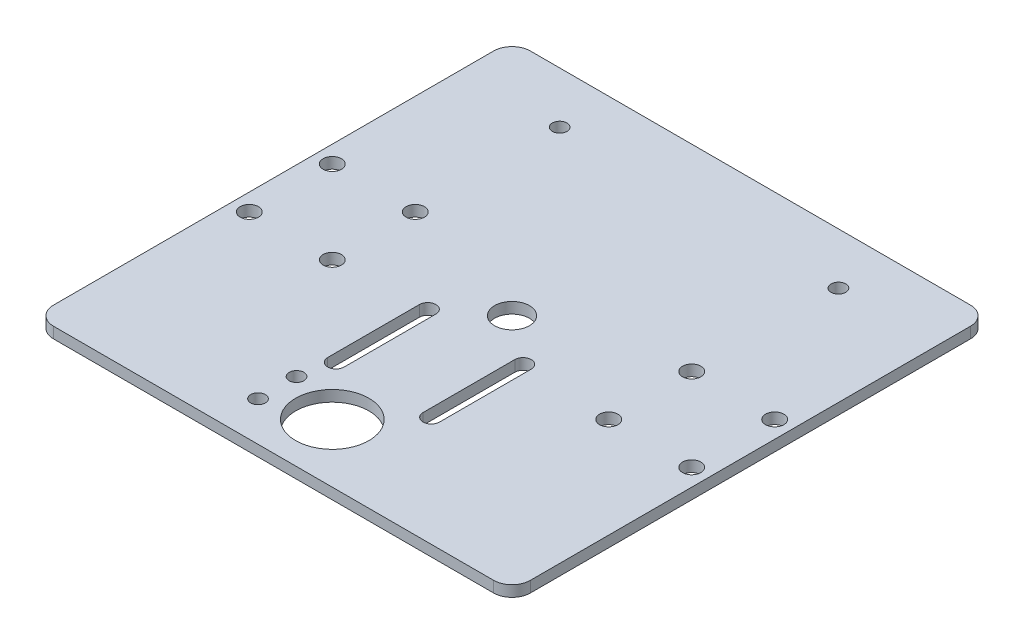
ISO-10303-21;
HEADER;
FILE_DESCRIPTION(('STEP AP214'),'2;1');
FILE_NAME('part.step','',(''),(''),'','','');
FILE_SCHEMA(('AUTOMOTIVE_DESIGN { 1 0 10303 214 1 1 1 1 }'));
ENDSEC;
DATA;
#1=APPLICATION_CONTEXT('core data for automotive mechanical design processes');
#2=APPLICATION_PROTOCOL_DEFINITION('international standard','automotive_design',2000,#1);
#3=PRODUCT_CONTEXT('',#1,'mechanical');
#4=PRODUCT('Part','Part','',(#3));
#5=PRODUCT_RELATED_PRODUCT_CATEGORY('part','',(#4));
#6=PRODUCT_DEFINITION_FORMATION('','',#4);
#7=PRODUCT_DEFINITION_CONTEXT('part definition',#1,'design');
#8=PRODUCT_DEFINITION('design','',#6,#7);
#9=PRODUCT_DEFINITION_SHAPE('','',#8);
#10=(LENGTH_UNIT() NAMED_UNIT(*) SI_UNIT(.MILLI.,.METRE.));
#11=(NAMED_UNIT(*) PLANE_ANGLE_UNIT() SI_UNIT($,.RADIAN.));
#12=(NAMED_UNIT(*) SI_UNIT($,.STERADIAN.) SOLID_ANGLE_UNIT());
#13=UNCERTAINTY_MEASURE_WITH_UNIT(LENGTH_MEASURE(1.E-05),#10,'distance_accuracy_value','');
#14=(GEOMETRIC_REPRESENTATION_CONTEXT(3) GLOBAL_UNCERTAINTY_ASSIGNED_CONTEXT((#13)) GLOBAL_UNIT_ASSIGNED_CONTEXT((#10,
#11,#12)) REPRESENTATION_CONTEXT('',''));
#15=CARTESIAN_POINT('',(0.,0.,0.));
#16=DIRECTION('',(0.,0.,1.));
#17=DIRECTION('',(1.,0.,0.));
#18=AXIS2_PLACEMENT_3D('',#15,#16,#17);
#19=CARTESIAN_POINT('',(0.,0.,0.));
#20=DIRECTION('',(0.,1.,0.));
#21=DIRECTION('',(0.,0.,1.));
#22=AXIS2_PLACEMENT_3D('',#19,#20,#21);
#23=PLANE('',#22);
#24=CARTESIAN_POINT('',(-15.,0.,54.25));
#25=DIRECTION('',(0.,1.,0.));
#26=DIRECTION('',(0.,0.,1.));
#27=AXIS2_PLACEMENT_3D('',#24,#25,#26);
#28=CIRCLE('',#27,2.);
#29=CARTESIAN_POINT('',(-15.,0.,56.25));
#30=VERTEX_POINT('',#29);
#31=EDGE_CURVE('E655',#30,#30,#28,.T.);
#32=ORIENTED_EDGE('',*,*,#31,.T.);
#33=EDGE_LOOP('',(#32));
#34=FACE_BOUND('',#33,.T.);
#35=CARTESIAN_POINT('',(-15.,0.,43.75));
#36=DIRECTION('',(0.,1.,0.));
#37=DIRECTION('',(0.,0.,1.));
#38=AXIS2_PLACEMENT_3D('',#35,#36,#37);
#39=CIRCLE('',#38,2.);
#40=CARTESIAN_POINT('',(-15.,0.,45.75));
#41=VERTEX_POINT('',#40);
#42=EDGE_CURVE('E175',#41,#41,#39,.T.);
#43=ORIENTED_EDGE('',*,*,#42,.T.);
#44=EDGE_LOOP('',(#43));
#45=FACE_BOUND('',#44,.T.);
#46=CARTESIAN_POINT('',(13.,0.,35.));
#47=DIRECTION('',(0.,1.,0.));
#48=DIRECTION('',(0.,0.,1.));
#49=AXIS2_PLACEMENT_3D('',#46,#47,#48);
#50=CIRCLE('',#49,2.25);
#51=CARTESIAN_POINT('',(10.75,0.,35.));
#52=VERTEX_POINT('',#51);
#53=CARTESIAN_POINT('',(15.25,0.,35.));
#54=VERTEX_POINT('',#53);
#55=EDGE_CURVE('E188',#52,#54,#50,.T.);
#56=ORIENTED_EDGE('',*,*,#55,.T.);
#57=DIRECTION('',(0.,0.,-1.));
#58=VECTOR('',#57,1.);
#59=CARTESIAN_POINT('',(15.25,0.,35.));
#60=LINE('',#59,#58);
#61=CARTESIAN_POINT('',(15.25,0.,10.));
#62=VERTEX_POINT('',#61);
#63=EDGE_CURVE('E204',#54,#62,#60,.T.);
#64=ORIENTED_EDGE('',*,*,#63,.T.);
#65=CARTESIAN_POINT('',(13.,0.,9.99999999999999));
#66=DIRECTION('',(0.,1.,0.));
#67=DIRECTION('',(0.,0.,1.));
#68=AXIS2_PLACEMENT_3D('',#65,#66,#67);
#69=CIRCLE('',#68,2.25);
#70=CARTESIAN_POINT('',(10.75,0.,9.99999999999999));
#71=VERTEX_POINT('',#70);
#72=EDGE_CURVE('E207',#62,#71,#69,.T.);
#73=ORIENTED_EDGE('',*,*,#72,.T.);
#74=DIRECTION('',(0.,0.,1.));
#75=VECTOR('',#74,1.);
#76=CARTESIAN_POINT('',(10.75,0.,35.));
#77=LINE('',#76,#75);
#78=EDGE_CURVE('E194',#71,#52,#77,.T.);
#79=ORIENTED_EDGE('',*,*,#78,.T.);
#80=EDGE_LOOP('',(#56,#64,#73,#79));
#81=FACE_BOUND('',#80,.T.);
#82=CARTESIAN_POINT('',(38.,0.,-51.));
#83=DIRECTION('',(0.,1.,0.));
#84=DIRECTION('',(0.,0.,1.));
#85=AXIS2_PLACEMENT_3D('',#82,#83,#84);
#86=CIRCLE('',#85,2.);
#87=CARTESIAN_POINT('',(38.,0.,-49.));
#88=VERTEX_POINT('',#87);
#89=EDGE_CURVE('E224',#88,#88,#86,.T.);
#90=ORIENTED_EDGE('',*,*,#89,.T.);
#91=EDGE_LOOP('',(#90));
#92=FACE_BOUND('',#91,.T.);
#93=CARTESIAN_POINT('',(-38.,0.,-51.));
#94=DIRECTION('',(0.,1.,0.));
#95=DIRECTION('',(0.,0.,1.));
#96=AXIS2_PLACEMENT_3D('',#93,#94,#95);
#97=CIRCLE('',#96,2.);
#98=CARTESIAN_POINT('',(-38.,0.,-49.));
#99=VERTEX_POINT('',#98);
#100=EDGE_CURVE('E230',#99,#99,#97,.T.);
#101=ORIENTED_EDGE('',*,*,#100,.T.);
#102=EDGE_LOOP('',(#101));
#103=FACE_BOUND('',#102,.T.);
#104=CARTESIAN_POINT('',(37.6862915010152,0.,11.3137084989847));
#105=DIRECTION('',(0.,-1.,0.));
#106=DIRECTION('',(0.,0.,-1.));
#107=AXIS2_PLACEMENT_3D('',#104,#105,#106);
#108=CIRCLE('',#107,2.5);
#109=CARTESIAN_POINT('',(37.6862915010152,0.,8.81370849898474));
#110=VERTEX_POINT('',#109);
#111=EDGE_CURVE('E245',#110,#110,#108,.T.);
#112=ORIENTED_EDGE('',*,*,#111,.F.);
#113=EDGE_LOOP('',(#112));
#114=FACE_BOUND('',#113,.T.);
#115=CARTESIAN_POINT('',(-60.3137084989848,0.,-11.3137084989848));
#116=DIRECTION('',(0.,-1.,0.));
#117=DIRECTION('',(0.,0.,-1.));
#118=AXIS2_PLACEMENT_3D('',#115,#116,#117);
#119=CIRCLE('',#118,2.5);
#120=CARTESIAN_POINT('',(-60.3137084989848,0.,-13.8137084989848));
#121=VERTEX_POINT('',#120);
#122=EDGE_CURVE('E257',#121,#121,#119,.T.);
#123=ORIENTED_EDGE('',*,*,#122,.F.);
#124=EDGE_LOOP('',(#123));
#125=FACE_BOUND('',#124,.T.);
#126=CARTESIAN_POINT('',(-60.3137084989848,0.,11.3137084989847));
#127=DIRECTION('',(0.,-1.,0.));
#128=DIRECTION('',(0.,0.,-1.));
#129=AXIS2_PLACEMENT_3D('',#126,#127,#128);
#130=CIRCLE('',#129,2.5);
#131=CARTESIAN_POINT('',(-60.3137084989848,0.,8.81370849898474));
#132=VERTEX_POINT('',#131);
#133=EDGE_CURVE('E263',#132,#132,#130,.T.);
#134=ORIENTED_EDGE('',*,*,#133,.F.);
#135=EDGE_LOOP('',(#134));
#136=FACE_BOUND('',#135,.T.);
#137=CARTESIAN_POINT('',(-37.6862915010152,0.,11.3137084989847));
#138=DIRECTION('',(0.,-1.,0.));
#139=DIRECTION('',(0.,0.,-1.));
#140=AXIS2_PLACEMENT_3D('',#137,#138,#139);
#141=CIRCLE('',#140,2.5);
#142=CARTESIAN_POINT('',(-37.6862915010152,0.,8.81370849898474));
#143=VERTEX_POINT('',#142);
#144=EDGE_CURVE('E269',#143,#143,#141,.T.);
#145=ORIENTED_EDGE('',*,*,#144,.F.);
#146=EDGE_LOOP('',(#145));
#147=FACE_BOUND('',#146,.T.);
#148=CARTESIAN_POINT('',(-37.6862915010152,0.,-11.3137084989848));
#149=DIRECTION('',(0.,-1.,0.));
#150=DIRECTION('',(0.,0.,-1.));
#151=AXIS2_PLACEMENT_3D('',#148,#149,#150);
#152=CIRCLE('',#151,2.5);
#153=CARTESIAN_POINT('',(-37.6862915010152,0.,-13.8137084989848));
#154=VERTEX_POINT('',#153);
#155=EDGE_CURVE('E275',#154,#154,#152,.T.);
#156=ORIENTED_EDGE('',*,*,#155,.F.);
#157=EDGE_LOOP('',(#156));
#158=FACE_BOUND('',#157,.T.);
#159=CARTESIAN_POINT('',(0.,0.,0.));
#160=DIRECTION('',(0.,1.,0.));
#161=DIRECTION('',(0.,0.,1.));
#162=AXIS2_PLACEMENT_3D('',#159,#160,#161);
#163=CIRCLE('',#162,4.75);
#164=CARTESIAN_POINT('',(0.,0.,4.74999999999999));
#165=VERTEX_POINT('',#164);
#166=EDGE_CURVE('E281',#165,#165,#163,.T.);
#167=ORIENTED_EDGE('',*,*,#166,.T.);
#168=EDGE_LOOP('',(#167));
#169=FACE_BOUND('',#168,.T.);
#170=DIRECTION('',(0.,0.,-1.));
#171=VECTOR('',#170,1.);
#172=CARTESIAN_POINT('',(65.,0.,-65.));
#173=LINE('',#172,#171);
#174=CARTESIAN_POINT('',(65.,0.,60.));
#175=VERTEX_POINT('',#174);
#176=CARTESIAN_POINT('',(65.,0.,-60.));
#177=VERTEX_POINT('',#176);
#178=EDGE_CURVE('E285',#175,#177,#173,.T.);
#179=ORIENTED_EDGE('',*,*,#178,.F.);
#180=CARTESIAN_POINT('',(60.,0.,60.));
#181=DIRECTION('',(0.,1.,0.));
#182=DIRECTION('',(0.,0.,1.));
#183=AXIS2_PLACEMENT_3D('',#180,#181,#182);
#184=CIRCLE('',#183,5.);
#185=CARTESIAN_POINT('',(60.,0.,65.));
#186=VERTEX_POINT('',#185);
#187=EDGE_CURVE('E322',#175,#186,#184,.F.);
#188=ORIENTED_EDGE('',*,*,#187,.T.);
#189=DIRECTION('',(1.,0.,0.));
#190=VECTOR('',#189,1.);
#191=CARTESIAN_POINT('',(-65.,0.,65.));
#192=LINE('',#191,#190);
#193=CARTESIAN_POINT('',(-60.,0.,65.));
#194=VERTEX_POINT('',#193);
#195=EDGE_CURVE('E292',#194,#186,#192,.T.);
#196=ORIENTED_EDGE('',*,*,#195,.F.);
#197=CARTESIAN_POINT('',(-60.,0.,60.));
#198=DIRECTION('',(0.,1.,0.));
#199=DIRECTION('',(0.,0.,1.));
#200=AXIS2_PLACEMENT_3D('',#197,#198,#199);
#201=CIRCLE('',#200,5.);
#202=CARTESIAN_POINT('',(-65.,0.,60.));
#203=VERTEX_POINT('',#202);
#204=EDGE_CURVE('E316',#194,#203,#201,.F.);
#205=ORIENTED_EDGE('',*,*,#204,.T.);
#206=DIRECTION('',(0.,0.,1.));
#207=VECTOR('',#206,1.);
#208=CARTESIAN_POINT('',(-65.,0.,-65.));
#209=LINE('',#208,#207);
#210=CARTESIAN_POINT('',(-65.,0.,-60.));
#211=VERTEX_POINT('',#210);
#212=EDGE_CURVE('E307',#211,#203,#209,.T.);
#213=ORIENTED_EDGE('',*,*,#212,.F.);
#214=CARTESIAN_POINT('',(-60.,0.,-60.));
#215=DIRECTION('',(0.,1.,0.));
#216=DIRECTION('',(0.,0.,1.));
#217=AXIS2_PLACEMENT_3D('',#214,#215,#216);
#218=CIRCLE('',#217,5.);
#219=CARTESIAN_POINT('',(-60.,0.,-65.));
#220=VERTEX_POINT('',#219);
#221=EDGE_CURVE('E318',#211,#220,#218,.F.);
#222=ORIENTED_EDGE('',*,*,#221,.T.);
#223=DIRECTION('',(-1.,0.,0.));
#224=VECTOR('',#223,1.);
#225=CARTESIAN_POINT('',(-65.,0.,-65.));
#226=LINE('',#225,#224);
#227=CARTESIAN_POINT('',(60.,0.,-65.));
#228=VERTEX_POINT('',#227);
#229=EDGE_CURVE('E304',#228,#220,#226,.T.);
#230=ORIENTED_EDGE('',*,*,#229,.F.);
#231=CARTESIAN_POINT('',(60.,0.,-60.));
#232=DIRECTION('',(0.,1.,0.));
#233=DIRECTION('',(0.,0.,1.));
#234=AXIS2_PLACEMENT_3D('',#231,#232,#233);
#235=CIRCLE('',#234,5.);
#236=EDGE_CURVE('E320',#228,#177,#235,.F.);
#237=ORIENTED_EDGE('',*,*,#236,.T.);
#238=EDGE_LOOP('',(#179,#188,#196,#205,#213,#222,#230,#237));
#239=FACE_BOUND('',#238,.T.);
#240=CARTESIAN_POINT('',(37.6862915010152,0.,-11.3137084989848));
#241=DIRECTION('',(0.,-1.,0.));
#242=DIRECTION('',(0.,0.,-1.));
#243=AXIS2_PLACEMENT_3D('',#240,#241,#242);
#244=CIRCLE('',#243,2.5);
#245=CARTESIAN_POINT('',(37.6862915010152,0.,-13.8137084989848));
#246=VERTEX_POINT('',#245);
#247=EDGE_CURVE('E251',#246,#246,#244,.T.);
#248=ORIENTED_EDGE('',*,*,#247,.F.);
#249=EDGE_LOOP('',(#248));
#250=FACE_BOUND('',#249,.T.);
#251=CARTESIAN_POINT('',(60.3137084989848,0.,11.3137084989847));
#252=DIRECTION('',(0.,-1.,0.));
#253=DIRECTION('',(0.,0.,-1.));
#254=AXIS2_PLACEMENT_3D('',#251,#252,#253);
#255=CIRCLE('',#254,2.5);
#256=CARTESIAN_POINT('',(60.3137084989848,0.,8.81370849898474));
#257=VERTEX_POINT('',#256);
#258=EDGE_CURVE('E239',#257,#257,#255,.T.);
#259=ORIENTED_EDGE('',*,*,#258,.F.);
#260=EDGE_LOOP('',(#259));
#261=FACE_BOUND('',#260,.T.);
#262=CARTESIAN_POINT('',(60.3137084989848,0.,-11.3137084989848));
#263=DIRECTION('',(0.,-1.,0.));
#264=DIRECTION('',(0.,0.,-1.));
#265=AXIS2_PLACEMENT_3D('',#262,#263,#264);
#266=CIRCLE('',#265,2.5);
#267=CARTESIAN_POINT('',(60.3137084989848,0.,-13.8137084989848));
#268=VERTEX_POINT('',#267);
#269=EDGE_CURVE('E233',#268,#268,#266,.T.);
#270=ORIENTED_EDGE('',*,*,#269,.F.);
#271=EDGE_LOOP('',(#270));
#272=FACE_BOUND('',#271,.T.);
#273=CARTESIAN_POINT('',(0.,0.,49.));
#274=DIRECTION('',(0.,1.,0.));
#275=DIRECTION('',(0.,0.,1.));
#276=AXIS2_PLACEMENT_3D('',#273,#274,#275);
#277=CIRCLE('',#276,10.);
#278=CARTESIAN_POINT('',(0.,0.,59.));
#279=VERTEX_POINT('',#278);
#280=EDGE_CURVE('E162',#279,#279,#277,.T.);
#281=ORIENTED_EDGE('',*,*,#280,.T.);
#282=EDGE_LOOP('',(#281));
#283=FACE_BOUND('',#282,.T.);
#284=CARTESIAN_POINT('',(-13.,0.,35.));
#285=DIRECTION('',(0.,1.,0.));
#286=DIRECTION('',(0.,0.,-1.));
#287=AXIS2_PLACEMENT_3D('',#284,#285,#286);
#288=CIRCLE('',#287,2.25);
#289=CARTESIAN_POINT('',(-15.25,0.,35.));
#290=VERTEX_POINT('',#289);
#291=CARTESIAN_POINT('',(-10.75,0.,35.));
#292=VERTEX_POINT('',#291);
#293=EDGE_CURVE('E48',#290,#292,#288,.T.);
#294=ORIENTED_EDGE('',*,*,#293,.T.);
#295=DIRECTION('',(0.,0.,-1.));
#296=VECTOR('',#295,1.);
#297=CARTESIAN_POINT('',(-10.75,0.,35.));
#298=LINE('',#297,#296);
#299=CARTESIAN_POINT('',(-10.75,0.,10.));
#300=VERTEX_POINT('',#299);
#301=EDGE_CURVE('E161',#292,#300,#298,.T.);
#302=ORIENTED_EDGE('',*,*,#301,.T.);
#303=CARTESIAN_POINT('',(-13.,0.,10.));
#304=DIRECTION('',(0.,1.,0.));
#305=DIRECTION('',(0.,0.,-1.));
#306=AXIS2_PLACEMENT_3D('',#303,#304,#305);
#307=CIRCLE('',#306,2.25);
#308=CARTESIAN_POINT('',(-15.25,0.,10.));
#309=VERTEX_POINT('',#308);
#310=EDGE_CURVE('E177',#300,#309,#307,.T.);
#311=ORIENTED_EDGE('',*,*,#310,.T.);
#312=DIRECTION('',(0.,0.,1.));
#313=VECTOR('',#312,1.);
#314=CARTESIAN_POINT('',(-15.25,0.,35.));
#315=LINE('',#314,#313);
#316=EDGE_CURVE('E155',#309,#290,#315,.T.);
#317=ORIENTED_EDGE('',*,*,#316,.T.);
#318=EDGE_LOOP('',(#294,#302,#311,#317));
#319=FACE_BOUND('',#318,.T.);
#320=ADVANCED_FACE('F33',(#34,#45,#81,#92,#103,#114,#125,#136,#147,#158,#169,#239,#250,#261,
#272,#283,#319),#23,.F.);
#321=CARTESIAN_POINT('',(0.,3.,0.));
#322=DIRECTION('',(0.,1.,0.));
#323=DIRECTION('',(0.,0.,1.));
#324=AXIS2_PLACEMENT_3D('',#321,#322,#323);
#325=PLANE('',#324);
#326=CARTESIAN_POINT('',(-15.,3.,54.25));
#327=DIRECTION('',(0.,1.,0.));
#328=DIRECTION('',(0.,0.,1.));
#329=AXIS2_PLACEMENT_3D('',#326,#327,#328);
#330=CIRCLE('',#329,2.);
#331=CARTESIAN_POINT('',(-15.,3.,56.25));
#332=VERTEX_POINT('',#331);
#333=EDGE_CURVE('E658',#332,#332,#330,.T.);
#334=ORIENTED_EDGE('',*,*,#333,.F.);
#335=EDGE_LOOP('',(#334));
#336=FACE_BOUND('',#335,.T.);
#337=CARTESIAN_POINT('',(-15.,3.,43.75));
#338=DIRECTION('',(0.,1.,0.));
#339=DIRECTION('',(0.,0.,1.));
#340=AXIS2_PLACEMENT_3D('',#337,#338,#339);
#341=CIRCLE('',#340,2.);
#342=CARTESIAN_POINT('',(-15.,3.,45.75));
#343=VERTEX_POINT('',#342);
#344=EDGE_CURVE('E660',#343,#343,#341,.T.);
#345=ORIENTED_EDGE('',*,*,#344,.F.);
#346=EDGE_LOOP('',(#345));
#347=FACE_BOUND('',#346,.T.);
#348=CARTESIAN_POINT('',(0.,3.,49.));
#349=DIRECTION('',(0.,1.,0.));
#350=DIRECTION('',(0.,0.,1.));
#351=AXIS2_PLACEMENT_3D('',#348,#349,#350);
#352=CIRCLE('',#351,10.);
#353=CARTESIAN_POINT('',(0.,3.,59.));
#354=VERTEX_POINT('',#353);
#355=EDGE_CURVE('E185',#354,#354,#352,.T.);
#356=ORIENTED_EDGE('',*,*,#355,.F.);
#357=EDGE_LOOP('',(#356));
#358=FACE_BOUND('',#357,.T.);
#359=CARTESIAN_POINT('',(38.,3.,-51.));
#360=DIRECTION('',(0.,1.,0.));
#361=DIRECTION('',(0.,0.,1.));
#362=AXIS2_PLACEMENT_3D('',#359,#360,#361);
#363=CIRCLE('',#362,2.);
#364=CARTESIAN_POINT('',(38.,3.,-49.));
#365=VERTEX_POINT('',#364);
#366=EDGE_CURVE('E221',#365,#365,#363,.T.);
#367=ORIENTED_EDGE('',*,*,#366,.F.);
#368=EDGE_LOOP('',(#367));
#369=FACE_BOUND('',#368,.T.);
#370=CARTESIAN_POINT('',(-38.,3.,-51.));
#371=DIRECTION('',(0.,1.,0.));
#372=DIRECTION('',(0.,0.,1.));
#373=AXIS2_PLACEMENT_3D('',#370,#371,#372);
#374=CIRCLE('',#373,2.);
#375=CARTESIAN_POINT('',(-38.,3.,-49.));
#376=VERTEX_POINT('',#375);
#377=EDGE_CURVE('E227',#376,#376,#374,.T.);
#378=ORIENTED_EDGE('',*,*,#377,.F.);
#379=EDGE_LOOP('',(#378));
#380=FACE_BOUND('',#379,.T.);
#381=CARTESIAN_POINT('',(60.3137084989848,3.,11.3137084989847));
#382=DIRECTION('',(0.,-1.,0.));
#383=DIRECTION('',(0.,0.,-1.));
#384=AXIS2_PLACEMENT_3D('',#381,#382,#383);
#385=CIRCLE('',#384,2.5);
#386=CARTESIAN_POINT('',(60.3137084989848,3.,8.81370849898474));
#387=VERTEX_POINT('',#386);
#388=EDGE_CURVE('E242',#387,#387,#385,.T.);
#389=ORIENTED_EDGE('',*,*,#388,.T.);
#390=EDGE_LOOP('',(#389));
#391=FACE_BOUND('',#390,.T.);
#392=DIRECTION('',(1.,0.,0.));
#393=VECTOR('',#392,1.);
#394=CARTESIAN_POINT('',(-65.,3.,65.));
#395=LINE('',#394,#393);
#396=CARTESIAN_POINT('',(-60.,3.,65.));
#397=VERTEX_POINT('',#396);
#398=CARTESIAN_POINT('',(60.,3.,65.));
#399=VERTEX_POINT('',#398);
#400=EDGE_CURVE('E298',#397,#399,#395,.T.);
#401=ORIENTED_EDGE('',*,*,#400,.T.);
#402=CARTESIAN_POINT('',(60.,3.,60.));
#403=DIRECTION('',(0.,1.,0.));
#404=DIRECTION('',(0.,0.,1.));
#405=AXIS2_PLACEMENT_3D('',#402,#403,#404);
#406=CIRCLE('',#405,5.);
#407=CARTESIAN_POINT('',(65.,3.,60.));
#408=VERTEX_POINT('',#407);
#409=EDGE_CURVE('E335',#399,#408,#406,.T.);
#410=ORIENTED_EDGE('',*,*,#409,.T.);
#411=DIRECTION('',(0.,0.,-1.));
#412=VECTOR('',#411,1.);
#413=CARTESIAN_POINT('',(65.,3.,-65.));
#414=LINE('',#413,#412);
#415=CARTESIAN_POINT('',(65.,3.,-60.));
#416=VERTEX_POINT('',#415);
#417=EDGE_CURVE('E288',#408,#416,#414,.T.);
#418=ORIENTED_EDGE('',*,*,#417,.T.);
#419=CARTESIAN_POINT('',(60.,3.,-60.));
#420=DIRECTION('',(0.,1.,0.));
#421=DIRECTION('',(0.,0.,1.));
#422=AXIS2_PLACEMENT_3D('',#419,#420,#421);
#423=CIRCLE('',#422,5.);
#424=CARTESIAN_POINT('',(60.,3.,-65.));
#425=VERTEX_POINT('',#424);
#426=EDGE_CURVE('E333',#416,#425,#423,.T.);
#427=ORIENTED_EDGE('',*,*,#426,.T.);
#428=DIRECTION('',(-1.,0.,0.));
#429=VECTOR('',#428,1.);
#430=CARTESIAN_POINT('',(-65.,3.,-65.));
#431=LINE('',#430,#429);
#432=CARTESIAN_POINT('',(-60.,3.,-65.));
#433=VERTEX_POINT('',#432);
#434=EDGE_CURVE('E291',#425,#433,#431,.T.);
#435=ORIENTED_EDGE('',*,*,#434,.T.);
#436=CARTESIAN_POINT('',(-60.,3.,-60.));
#437=DIRECTION('',(0.,1.,0.));
#438=DIRECTION('',(0.,0.,1.));
#439=AXIS2_PLACEMENT_3D('',#436,#437,#438);
#440=CIRCLE('',#439,5.);
#441=CARTESIAN_POINT('',(-65.,3.,-60.));
#442=VERTEX_POINT('',#441);
#443=EDGE_CURVE('E331',#433,#442,#440,.T.);
#444=ORIENTED_EDGE('',*,*,#443,.T.);
#445=DIRECTION('',(0.,0.,1.));
#446=VECTOR('',#445,1.);
#447=CARTESIAN_POINT('',(-65.,3.,-65.));
#448=LINE('',#447,#446);
#449=CARTESIAN_POINT('',(-65.,3.,60.));
#450=VERTEX_POINT('',#449);
#451=EDGE_CURVE('E295',#442,#450,#448,.T.);
#452=ORIENTED_EDGE('',*,*,#451,.T.);
#453=CARTESIAN_POINT('',(-60.,3.,60.));
#454=DIRECTION('',(0.,1.,0.));
#455=DIRECTION('',(0.,0.,1.));
#456=AXIS2_PLACEMENT_3D('',#453,#454,#455);
#457=CIRCLE('',#456,5.);
#458=EDGE_CURVE('E329',#450,#397,#457,.T.);
#459=ORIENTED_EDGE('',*,*,#458,.T.);
#460=EDGE_LOOP('',(#401,#410,#418,#427,#435,#444,#452,#459));
#461=FACE_BOUND('',#460,.T.);
#462=CARTESIAN_POINT('',(0.,3.,0.));
#463=DIRECTION('',(0.,1.,0.));
#464=DIRECTION('',(0.,0.,1.));
#465=AXIS2_PLACEMENT_3D('',#462,#463,#464);
#466=CIRCLE('',#465,4.75);
#467=CARTESIAN_POINT('',(0.,3.,4.74999999999999));
#468=VERTEX_POINT('',#467);
#469=EDGE_CURVE('E282',#468,#468,#466,.T.);
#470=ORIENTED_EDGE('',*,*,#469,.F.);
#471=EDGE_LOOP('',(#470));
#472=FACE_BOUND('',#471,.T.);
#473=CARTESIAN_POINT('',(-37.6862915010152,3.,-11.3137084989848));
#474=DIRECTION('',(0.,-1.,0.));
#475=DIRECTION('',(0.,0.,-1.));
#476=AXIS2_PLACEMENT_3D('',#473,#474,#475);
#477=CIRCLE('',#476,2.5);
#478=CARTESIAN_POINT('',(-37.6862915010152,3.,-13.8137084989848));
#479=VERTEX_POINT('',#478);
#480=EDGE_CURVE('E278',#479,#479,#477,.T.);
#481=ORIENTED_EDGE('',*,*,#480,.T.);
#482=EDGE_LOOP('',(#481));
#483=FACE_BOUND('',#482,.T.);
#484=CARTESIAN_POINT('',(-37.6862915010152,3.,11.3137084989847));
#485=DIRECTION('',(0.,-1.,0.));
#486=DIRECTION('',(0.,0.,-1.));
#487=AXIS2_PLACEMENT_3D('',#484,#485,#486);
#488=CIRCLE('',#487,2.5);
#489=CARTESIAN_POINT('',(-37.6862915010152,3.,8.81370849898474));
#490=VERTEX_POINT('',#489);
#491=EDGE_CURVE('E272',#490,#490,#488,.T.);
#492=ORIENTED_EDGE('',*,*,#491,.T.);
#493=EDGE_LOOP('',(#492));
#494=FACE_BOUND('',#493,.T.);
#495=CARTESIAN_POINT('',(-60.3137084989848,3.,11.3137084989847));
#496=DIRECTION('',(0.,-1.,0.));
#497=DIRECTION('',(0.,0.,-1.));
#498=AXIS2_PLACEMENT_3D('',#495,#496,#497);
#499=CIRCLE('',#498,2.5);
#500=CARTESIAN_POINT('',(-60.3137084989848,3.,8.81370849898474));
#501=VERTEX_POINT('',#500);
#502=EDGE_CURVE('E266',#501,#501,#499,.T.);
#503=ORIENTED_EDGE('',*,*,#502,.T.);
#504=EDGE_LOOP('',(#503));
#505=FACE_BOUND('',#504,.T.);
#506=CARTESIAN_POINT('',(-60.3137084989848,3.,-11.3137084989848));
#507=DIRECTION('',(0.,-1.,0.));
#508=DIRECTION('',(0.,0.,-1.));
#509=AXIS2_PLACEMENT_3D('',#506,#507,#508);
#510=CIRCLE('',#509,2.5);
#511=CARTESIAN_POINT('',(-60.3137084989848,3.,-13.8137084989848));
#512=VERTEX_POINT('',#511);
#513=EDGE_CURVE('E260',#512,#512,#510,.T.);
#514=ORIENTED_EDGE('',*,*,#513,.T.);
#515=EDGE_LOOP('',(#514));
#516=FACE_BOUND('',#515,.T.);
#517=CARTESIAN_POINT('',(37.6862915010152,3.,-11.3137084989848));
#518=DIRECTION('',(0.,-1.,0.));
#519=DIRECTION('',(0.,0.,-1.));
#520=AXIS2_PLACEMENT_3D('',#517,#518,#519);
#521=CIRCLE('',#520,2.5);
#522=CARTESIAN_POINT('',(37.6862915010152,3.,-13.8137084989848));
#523=VERTEX_POINT('',#522);
#524=EDGE_CURVE('E254',#523,#523,#521,.T.);
#525=ORIENTED_EDGE('',*,*,#524,.T.);
#526=EDGE_LOOP('',(#525));
#527=FACE_BOUND('',#526,.T.);
#528=CARTESIAN_POINT('',(37.6862915010152,3.,11.3137084989847));
#529=DIRECTION('',(0.,-1.,0.));
#530=DIRECTION('',(0.,0.,-1.));
#531=AXIS2_PLACEMENT_3D('',#528,#529,#530);
#532=CIRCLE('',#531,2.5);
#533=CARTESIAN_POINT('',(37.6862915010152,3.,8.81370849898474));
#534=VERTEX_POINT('',#533);
#535=EDGE_CURVE('E248',#534,#534,#532,.T.);
#536=ORIENTED_EDGE('',*,*,#535,.T.);
#537=EDGE_LOOP('',(#536));
#538=FACE_BOUND('',#537,.T.);
#539=CARTESIAN_POINT('',(60.3137084989848,3.,-11.3137084989848));
#540=DIRECTION('',(0.,-1.,0.));
#541=DIRECTION('',(0.,0.,-1.));
#542=AXIS2_PLACEMENT_3D('',#539,#540,#541);
#543=CIRCLE('',#542,2.5);
#544=CARTESIAN_POINT('',(60.3137084989848,3.,-13.8137084989848));
#545=VERTEX_POINT('',#544);
#546=EDGE_CURVE('E236',#545,#545,#543,.T.);
#547=ORIENTED_EDGE('',*,*,#546,.T.);
#548=EDGE_LOOP('',(#547));
#549=FACE_BOUND('',#548,.T.);
#550=DIRECTION('',(0.,0.,-1.));
#551=VECTOR('',#550,1.);
#552=CARTESIAN_POINT('',(15.25,3.,35.));
#553=LINE('',#552,#551);
#554=CARTESIAN_POINT('',(15.25,3.,35.));
#555=VERTEX_POINT('',#554);
#556=CARTESIAN_POINT('',(15.25,3.,10.));
#557=VERTEX_POINT('',#556);
#558=EDGE_CURVE('E193',#555,#557,#553,.T.);
#559=ORIENTED_EDGE('',*,*,#558,.F.);
#560=CARTESIAN_POINT('',(13.,3.,35.));
#561=DIRECTION('',(0.,1.,0.));
#562=DIRECTION('',(0.,0.,1.));
#563=AXIS2_PLACEMENT_3D('',#560,#561,#562);
#564=CIRCLE('',#563,2.25);
#565=CARTESIAN_POINT('',(10.75,3.,35.));
#566=VERTEX_POINT('',#565);
#567=EDGE_CURVE('E191',#566,#555,#564,.T.);
#568=ORIENTED_EDGE('',*,*,#567,.F.);
#569=DIRECTION('',(0.,0.,1.));
#570=VECTOR('',#569,1.);
#571=CARTESIAN_POINT('',(10.75,3.,35.));
#572=LINE('',#571,#570);
#573=CARTESIAN_POINT('',(10.75,3.,9.99999999999999));
#574=VERTEX_POINT('',#573);
#575=EDGE_CURVE('E199',#574,#566,#572,.T.);
#576=ORIENTED_EDGE('',*,*,#575,.F.);
#577=CARTESIAN_POINT('',(13.,3.,9.99999999999999));
#578=DIRECTION('',(0.,1.,0.));
#579=DIRECTION('',(0.,0.,1.));
#580=AXIS2_PLACEMENT_3D('',#577,#578,#579);
#581=CIRCLE('',#580,2.25);
#582=EDGE_CURVE('E196',#557,#574,#581,.T.);
#583=ORIENTED_EDGE('',*,*,#582,.F.);
#584=EDGE_LOOP('',(#559,#568,#576,#583));
#585=FACE_BOUND('',#584,.T.);
#586=DIRECTION('',(0.,0.,-1.));
#587=VECTOR('',#586,1.);
#588=CARTESIAN_POINT('',(-10.75,3.,35.));
#589=LINE('',#588,#587);
#590=CARTESIAN_POINT('',(-10.75,3.,35.));
#591=VERTEX_POINT('',#590);
#592=CARTESIAN_POINT('',(-10.75,3.,10.));
#593=VERTEX_POINT('',#592);
#594=EDGE_CURVE('E154',#591,#593,#589,.T.);
#595=ORIENTED_EDGE('',*,*,#594,.F.);
#596=CARTESIAN_POINT('',(-13.,3.,35.));
#597=DIRECTION('',(0.,1.,0.));
#598=DIRECTION('',(0.,0.,-1.));
#599=AXIS2_PLACEMENT_3D('',#596,#597,#598);
#600=CIRCLE('',#599,2.25);
#601=CARTESIAN_POINT('',(-15.25,3.,35.));
#602=VERTEX_POINT('',#601);
#603=EDGE_CURVE('E146',#602,#591,#600,.T.);
#604=ORIENTED_EDGE('',*,*,#603,.F.);
#605=DIRECTION('',(0.,0.,1.));
#606=VECTOR('',#605,1.);
#607=CARTESIAN_POINT('',(-15.25,3.,35.));
#608=LINE('',#607,#606);
#609=CARTESIAN_POINT('',(-15.25,3.,10.));
#610=VERTEX_POINT('',#609);
#611=EDGE_CURVE('E169',#610,#602,#608,.T.);
#612=ORIENTED_EDGE('',*,*,#611,.F.);
#613=CARTESIAN_POINT('',(-13.,3.,10.));
#614=DIRECTION('',(0.,1.,0.));
#615=DIRECTION('',(0.,0.,-1.));
#616=AXIS2_PLACEMENT_3D('',#613,#614,#615);
#617=CIRCLE('',#616,2.25);
#618=EDGE_CURVE('E167',#593,#610,#617,.T.);
#619=ORIENTED_EDGE('',*,*,#618,.F.);
#620=EDGE_LOOP('',(#595,#604,#612,#619));
#621=FACE_BOUND('',#620,.T.);
#622=ADVANCED_FACE('F166',(#336,#347,#358,#369,#380,#391,#461,#472,#483,#494,#505,#516,#527,
#538,#549,#585,#621),#325,.T.);
#623=CARTESIAN_POINT('',(65.,3.,-65.));
#624=DIRECTION('',(-1.,0.,0.));
#625=DIRECTION('',(0.,0.,1.));
#626=AXIS2_PLACEMENT_3D('',#623,#624,#625);
#627=PLANE('',#626);
#628=ORIENTED_EDGE('',*,*,#417,.F.);
#629=DIRECTION('',(0.,-1.,0.));
#630=VECTOR('',#629,1.);
#631=CARTESIAN_POINT('',(65.,3.,60.));
#632=LINE('',#631,#630);
#633=EDGE_CURVE('E313',#408,#175,#632,.T.);
#634=ORIENTED_EDGE('',*,*,#633,.T.);
#635=ORIENTED_EDGE('',*,*,#178,.T.);
#636=DIRECTION('',(0.,-1.,0.));
#637=VECTOR('',#636,1.);
#638=CARTESIAN_POINT('',(65.,3.,-60.));
#639=LINE('',#638,#637);
#640=EDGE_CURVE('E301',#177,#416,#639,.F.);
#641=ORIENTED_EDGE('',*,*,#640,.T.);
#642=EDGE_LOOP('',(#628,#634,#635,#641));
#643=FACE_BOUND('',#642,.T.);
#644=ADVANCED_FACE('F367',(#643),#627,.F.);
#645=CARTESIAN_POINT('',(-65.,3.,-65.));
#646=DIRECTION('',(0.,0.,1.));
#647=DIRECTION('',(1.,0.,0.));
#648=AXIS2_PLACEMENT_3D('',#645,#646,#647);
#649=PLANE('',#648);
#650=ORIENTED_EDGE('',*,*,#434,.F.);
#651=DIRECTION('',(0.,-1.,0.));
#652=VECTOR('',#651,1.);
#653=CARTESIAN_POINT('',(60.,3.,-65.));
#654=LINE('',#653,#652);
#655=EDGE_CURVE('E339',#425,#228,#654,.T.);
#656=ORIENTED_EDGE('',*,*,#655,.T.);
#657=ORIENTED_EDGE('',*,*,#229,.T.);
#658=DIRECTION('',(0.,-1.,0.));
#659=VECTOR('',#658,1.);
#660=CARTESIAN_POINT('',(-60.,3.,-65.));
#661=LINE('',#660,#659);
#662=EDGE_CURVE('E337',#220,#433,#661,.F.);
#663=ORIENTED_EDGE('',*,*,#662,.T.);
#664=EDGE_LOOP('',(#650,#656,#657,#663));
#665=FACE_BOUND('',#664,.T.);
#666=ADVANCED_FACE('F376',(#665),#649,.F.);
#667=CARTESIAN_POINT('',(-65.,3.,-65.));
#668=DIRECTION('',(1.,0.,0.));
#669=DIRECTION('',(0.,0.,-1.));
#670=AXIS2_PLACEMENT_3D('',#667,#668,#669);
#671=PLANE('',#670);
#672=ORIENTED_EDGE('',*,*,#451,.F.);
#673=DIRECTION('',(0.,-1.,0.));
#674=VECTOR('',#673,1.);
#675=CARTESIAN_POINT('',(-65.,3.,-60.));
#676=LINE('',#675,#674);
#677=EDGE_CURVE('E11',#442,#211,#676,.T.);
#678=ORIENTED_EDGE('',*,*,#677,.T.);
#679=ORIENTED_EDGE('',*,*,#212,.T.);
#680=DIRECTION('',(0.,-1.,0.));
#681=VECTOR('',#680,1.);
#682=CARTESIAN_POINT('',(-65.,3.,60.));
#683=LINE('',#682,#681);
#684=EDGE_CURVE('E41',#203,#450,#683,.F.);
#685=ORIENTED_EDGE('',*,*,#684,.T.);
#686=EDGE_LOOP('',(#672,#678,#679,#685));
#687=FACE_BOUND('',#686,.T.);
#688=ADVANCED_FACE('F344',(#687),#671,.F.);
#689=CARTESIAN_POINT('',(-65.,3.,65.));
#690=DIRECTION('',(0.,0.,-1.));
#691=DIRECTION('',(-1.,0.,0.));
#692=AXIS2_PLACEMENT_3D('',#689,#690,#691);
#693=PLANE('',#692);
#694=ORIENTED_EDGE('',*,*,#195,.T.);
#695=DIRECTION('',(0.,-1.,0.));
#696=VECTOR('',#695,1.);
#697=CARTESIAN_POINT('',(60.,3.,65.));
#698=LINE('',#697,#696);
#699=EDGE_CURVE('E327',#186,#399,#698,.F.);
#700=ORIENTED_EDGE('',*,*,#699,.T.);
#701=ORIENTED_EDGE('',*,*,#400,.F.);
#702=DIRECTION('',(0.,-1.,0.));
#703=VECTOR('',#702,1.);
#704=CARTESIAN_POINT('',(-60.,3.,65.));
#705=LINE('',#704,#703);
#706=EDGE_CURVE('E324',#397,#194,#705,.T.);
#707=ORIENTED_EDGE('',*,*,#706,.T.);
#708=EDGE_LOOP('',(#694,#700,#701,#707));
#709=FACE_BOUND('',#708,.T.);
#710=ADVANCED_FACE('F356',(#709),#693,.F.);
#711=CARTESIAN_POINT('',(60.,3.,60.));
#712=DIRECTION('',(0.,-1.,0.));
#713=DIRECTION('',(0.,0.,-1.));
#714=AXIS2_PLACEMENT_3D('',#711,#712,#713);
#715=CYLINDRICAL_SURFACE('',#714,5.);
#716=ORIENTED_EDGE('',*,*,#409,.F.);
#717=ORIENTED_EDGE('',*,*,#699,.F.);
#718=ORIENTED_EDGE('',*,*,#187,.F.);
#719=ORIENTED_EDGE('',*,*,#633,.F.);
#720=EDGE_LOOP('',(#716,#717,#718,#719));
#721=FACE_BOUND('',#720,.T.);
#722=ADVANCED_FACE('F364',(#721),#715,.T.);
#723=CARTESIAN_POINT('',(60.,3.,-60.));
#724=DIRECTION('',(0.,-1.,0.));
#725=DIRECTION('',(0.,0.,-1.));
#726=AXIS2_PLACEMENT_3D('',#723,#724,#725);
#727=CYLINDRICAL_SURFACE('',#726,5.);
#728=ORIENTED_EDGE('',*,*,#426,.F.);
#729=ORIENTED_EDGE('',*,*,#640,.F.);
#730=ORIENTED_EDGE('',*,*,#236,.F.);
#731=ORIENTED_EDGE('',*,*,#655,.F.);
#732=EDGE_LOOP('',(#728,#729,#730,#731));
#733=FACE_BOUND('',#732,.T.);
#734=ADVANCED_FACE('F373',(#733),#727,.T.);
#735=CARTESIAN_POINT('',(-60.,3.,-60.));
#736=DIRECTION('',(0.,-1.,0.));
#737=DIRECTION('',(0.,0.,-1.));
#738=AXIS2_PLACEMENT_3D('',#735,#736,#737);
#739=CYLINDRICAL_SURFACE('',#738,5.);
#740=ORIENTED_EDGE('',*,*,#443,.F.);
#741=ORIENTED_EDGE('',*,*,#662,.F.);
#742=ORIENTED_EDGE('',*,*,#221,.F.);
#743=ORIENTED_EDGE('',*,*,#677,.F.);
#744=EDGE_LOOP('',(#740,#741,#742,#743));
#745=FACE_BOUND('',#744,.T.);
#746=ADVANCED_FACE('F379',(#745),#739,.T.);
#747=CARTESIAN_POINT('',(-60.,3.,60.));
#748=DIRECTION('',(0.,-1.,0.));
#749=DIRECTION('',(0.,0.,-1.));
#750=AXIS2_PLACEMENT_3D('',#747,#748,#749);
#751=CYLINDRICAL_SURFACE('',#750,5.);
#752=ORIENTED_EDGE('',*,*,#458,.F.);
#753=ORIENTED_EDGE('',*,*,#684,.F.);
#754=ORIENTED_EDGE('',*,*,#204,.F.);
#755=ORIENTED_EDGE('',*,*,#706,.F.);
#756=EDGE_LOOP('',(#752,#753,#754,#755));
#757=FACE_BOUND('',#756,.T.);
#758=ADVANCED_FACE('F35',(#757),#751,.T.);
#759=CARTESIAN_POINT('',(0.,3.,0.));
#760=DIRECTION('',(0.,-1.,0.));
#761=DIRECTION('',(0.,0.,-1.));
#762=AXIS2_PLACEMENT_3D('',#759,#760,#761);
#763=CYLINDRICAL_SURFACE('',#762,4.75);
#764=ORIENTED_EDGE('',*,*,#469,.T.);
#765=EDGE_LOOP('',(#764));
#766=FACE_BOUND('',#765,.T.);
#767=ORIENTED_EDGE('',*,*,#166,.F.);
#768=EDGE_LOOP('',(#767));
#769=FACE_BOUND('',#768,.T.);
#770=ADVANCED_FACE('F385',(#766,#769),#763,.F.);
#771=CARTESIAN_POINT('',(-37.6862915010152,0.,-11.3137084989848));
#772=DIRECTION('',(0.,-1.,0.));
#773=DIRECTION('',(0.,0.,-1.));
#774=AXIS2_PLACEMENT_3D('',#771,#772,#773);
#775=CYLINDRICAL_SURFACE('',#774,2.5);
#776=ORIENTED_EDGE('',*,*,#480,.F.);
#777=EDGE_LOOP('',(#776));
#778=FACE_BOUND('',#777,.T.);
#779=ORIENTED_EDGE('',*,*,#155,.T.);
#780=EDGE_LOOP('',(#779));
#781=FACE_BOUND('',#780,.T.);
#782=ADVANCED_FACE('F435',(#778,#781),#775,.F.);
#783=CARTESIAN_POINT('',(-37.6862915010152,0.,11.3137084989847));
#784=DIRECTION('',(0.,-1.,0.));
#785=DIRECTION('',(0.,0.,-1.));
#786=AXIS2_PLACEMENT_3D('',#783,#784,#785);
#787=CYLINDRICAL_SURFACE('',#786,2.5);
#788=ORIENTED_EDGE('',*,*,#491,.F.);
#789=EDGE_LOOP('',(#788));
#790=FACE_BOUND('',#789,.T.);
#791=ORIENTED_EDGE('',*,*,#144,.T.);
#792=EDGE_LOOP('',(#791));
#793=FACE_BOUND('',#792,.T.);
#794=ADVANCED_FACE('F444',(#790,#793),#787,.F.);
#795=CARTESIAN_POINT('',(-60.3137084989848,0.,11.3137084989847));
#796=DIRECTION('',(0.,-1.,0.));
#797=DIRECTION('',(0.,0.,-1.));
#798=AXIS2_PLACEMENT_3D('',#795,#796,#797);
#799=CYLINDRICAL_SURFACE('',#798,2.5);
#800=ORIENTED_EDGE('',*,*,#502,.F.);
#801=EDGE_LOOP('',(#800));
#802=FACE_BOUND('',#801,.T.);
#803=ORIENTED_EDGE('',*,*,#133,.T.);
#804=EDGE_LOOP('',(#803));
#805=FACE_BOUND('',#804,.T.);
#806=ADVANCED_FACE('F454',(#802,#805),#799,.F.);
#807=CARTESIAN_POINT('',(-60.3137084989848,0.,-11.3137084989848));
#808=DIRECTION('',(0.,-1.,0.));
#809=DIRECTION('',(0.,0.,-1.));
#810=AXIS2_PLACEMENT_3D('',#807,#808,#809);
#811=CYLINDRICAL_SURFACE('',#810,2.5);
#812=ORIENTED_EDGE('',*,*,#513,.F.);
#813=EDGE_LOOP('',(#812));
#814=FACE_BOUND('',#813,.T.);
#815=ORIENTED_EDGE('',*,*,#122,.T.);
#816=EDGE_LOOP('',(#815));
#817=FACE_BOUND('',#816,.T.);
#818=ADVANCED_FACE('F464',(#814,#817),#811,.F.);
#819=CARTESIAN_POINT('',(37.6862915010152,0.,-11.3137084989848));
#820=DIRECTION('',(0.,-1.,0.));
#821=DIRECTION('',(0.,0.,-1.));
#822=AXIS2_PLACEMENT_3D('',#819,#820,#821);
#823=CYLINDRICAL_SURFACE('',#822,2.5);
#824=ORIENTED_EDGE('',*,*,#524,.F.);
#825=EDGE_LOOP('',(#824));
#826=FACE_BOUND('',#825,.T.);
#827=ORIENTED_EDGE('',*,*,#247,.T.);
#828=EDGE_LOOP('',(#827));
#829=FACE_BOUND('',#828,.T.);
#830=ADVANCED_FACE('F474',(#826,#829),#823,.F.);
#831=CARTESIAN_POINT('',(37.6862915010152,0.,11.3137084989847));
#832=DIRECTION('',(0.,-1.,0.));
#833=DIRECTION('',(0.,0.,-1.));
#834=AXIS2_PLACEMENT_3D('',#831,#832,#833);
#835=CYLINDRICAL_SURFACE('',#834,2.5);
#836=ORIENTED_EDGE('',*,*,#535,.F.);
#837=EDGE_LOOP('',(#836));
#838=FACE_BOUND('',#837,.T.);
#839=ORIENTED_EDGE('',*,*,#111,.T.);
#840=EDGE_LOOP('',(#839));
#841=FACE_BOUND('',#840,.T.);
#842=ADVANCED_FACE('F484',(#838,#841),#835,.F.);
#843=CARTESIAN_POINT('',(60.3137084989848,0.,11.3137084989847));
#844=DIRECTION('',(0.,-1.,0.));
#845=DIRECTION('',(0.,0.,-1.));
#846=AXIS2_PLACEMENT_3D('',#843,#844,#845);
#847=CYLINDRICAL_SURFACE('',#846,2.5);
#848=ORIENTED_EDGE('',*,*,#388,.F.);
#849=EDGE_LOOP('',(#848));
#850=FACE_BOUND('',#849,.T.);
#851=ORIENTED_EDGE('',*,*,#258,.T.);
#852=EDGE_LOOP('',(#851));
#853=FACE_BOUND('',#852,.T.);
#854=ADVANCED_FACE('F494',(#850,#853),#847,.F.);
#855=CARTESIAN_POINT('',(60.3137084989848,0.,-11.3137084989848));
#856=DIRECTION('',(0.,-1.,0.));
#857=DIRECTION('',(0.,0.,-1.));
#858=AXIS2_PLACEMENT_3D('',#855,#856,#857);
#859=CYLINDRICAL_SURFACE('',#858,2.5);
#860=ORIENTED_EDGE('',*,*,#546,.F.);
#861=EDGE_LOOP('',(#860));
#862=FACE_BOUND('',#861,.T.);
#863=ORIENTED_EDGE('',*,*,#269,.T.);
#864=EDGE_LOOP('',(#863));
#865=FACE_BOUND('',#864,.T.);
#866=ADVANCED_FACE('F504',(#862,#865),#859,.F.);
#867=CARTESIAN_POINT('',(-38.,3.,-51.));
#868=DIRECTION('',(0.,1.,0.));
#869=DIRECTION('',(0.,0.,1.));
#870=AXIS2_PLACEMENT_3D('',#867,#868,#869);
#871=CYLINDRICAL_SURFACE('',#870,2.);
#872=ORIENTED_EDGE('',*,*,#100,.F.);
#873=EDGE_LOOP('',(#872));
#874=FACE_BOUND('',#873,.T.);
#875=ORIENTED_EDGE('',*,*,#377,.T.);
#876=EDGE_LOOP('',(#875));
#877=FACE_BOUND('',#876,.T.);
#878=ADVANCED_FACE('F514',(#874,#877),#871,.F.);
#879=CARTESIAN_POINT('',(38.,3.,-51.));
#880=DIRECTION('',(0.,1.,0.));
#881=DIRECTION('',(0.,0.,1.));
#882=AXIS2_PLACEMENT_3D('',#879,#880,#881);
#883=CYLINDRICAL_SURFACE('',#882,2.);
#884=ORIENTED_EDGE('',*,*,#89,.F.);
#885=EDGE_LOOP('',(#884));
#886=FACE_BOUND('',#885,.T.);
#887=ORIENTED_EDGE('',*,*,#366,.T.);
#888=EDGE_LOOP('',(#887));
#889=FACE_BOUND('',#888,.T.);
#890=ADVANCED_FACE('F524',(#886,#889),#883,.F.);
#891=CARTESIAN_POINT('',(13.,3.,35.));
#892=DIRECTION('',(0.,-1.,0.));
#893=DIRECTION('',(0.,0.,-1.));
#894=AXIS2_PLACEMENT_3D('',#891,#892,#893);
#895=CYLINDRICAL_SURFACE('',#894,2.25);
#896=ORIENTED_EDGE('',*,*,#55,.F.);
#897=DIRECTION('',(0.,-1.,0.));
#898=VECTOR('',#897,1.);
#899=CARTESIAN_POINT('',(10.75,3.,35.));
#900=LINE('',#899,#898);
#901=EDGE_CURVE('E201',#566,#52,#900,.T.);
#902=ORIENTED_EDGE('',*,*,#901,.F.);
#903=ORIENTED_EDGE('',*,*,#567,.T.);
#904=DIRECTION('',(0.,-1.,0.));
#905=VECTOR('',#904,1.);
#906=CARTESIAN_POINT('',(15.25,3.,35.));
#907=LINE('',#906,#905);
#908=EDGE_CURVE('E218',#555,#54,#907,.T.);
#909=ORIENTED_EDGE('',*,*,#908,.T.);
#910=EDGE_LOOP('',(#896,#902,#903,#909));
#911=FACE_BOUND('',#910,.T.);
#912=ADVANCED_FACE('F534',(#911),#895,.F.);
#913=CARTESIAN_POINT('',(15.25,3.,35.));
#914=DIRECTION('',(-1.,0.,0.));
#915=DIRECTION('',(0.,0.,1.));
#916=AXIS2_PLACEMENT_3D('',#913,#914,#915);
#917=PLANE('',#916);
#918=ORIENTED_EDGE('',*,*,#63,.F.);
#919=ORIENTED_EDGE('',*,*,#908,.F.);
#920=ORIENTED_EDGE('',*,*,#558,.T.);
#921=DIRECTION('',(0.,-1.,0.));
#922=VECTOR('',#921,1.);
#923=CARTESIAN_POINT('',(15.25,3.,10.));
#924=LINE('',#923,#922);
#925=EDGE_CURVE('E216',#557,#62,#924,.T.);
#926=ORIENTED_EDGE('',*,*,#925,.T.);
#927=EDGE_LOOP('',(#918,#919,#920,#926));
#928=FACE_BOUND('',#927,.T.);
#929=ADVANCED_FACE('F545',(#928),#917,.T.);
#930=CARTESIAN_POINT('',(13.,3.,9.99999999999999));
#931=DIRECTION('',(0.,-1.,0.));
#932=DIRECTION('',(0.,0.,-1.));
#933=AXIS2_PLACEMENT_3D('',#930,#931,#932);
#934=CYLINDRICAL_SURFACE('',#933,2.25);
#935=ORIENTED_EDGE('',*,*,#72,.F.);
#936=ORIENTED_EDGE('',*,*,#925,.F.);
#937=ORIENTED_EDGE('',*,*,#582,.T.);
#938=DIRECTION('',(0.,-1.,0.));
#939=VECTOR('',#938,1.);
#940=CARTESIAN_POINT('',(10.75,3.,9.99999999999999));
#941=LINE('',#940,#939);
#942=EDGE_CURVE('E214',#574,#71,#941,.T.);
#943=ORIENTED_EDGE('',*,*,#942,.T.);
#944=EDGE_LOOP('',(#935,#936,#937,#943));
#945=FACE_BOUND('',#944,.T.);
#946=ADVANCED_FACE('F556',(#945),#934,.F.);
#947=CARTESIAN_POINT('',(10.75,3.,35.));
#948=DIRECTION('',(1.,0.,0.));
#949=DIRECTION('',(0.,0.,-1.));
#950=AXIS2_PLACEMENT_3D('',#947,#948,#949);
#951=PLANE('',#950);
#952=ORIENTED_EDGE('',*,*,#78,.F.);
#953=ORIENTED_EDGE('',*,*,#942,.F.);
#954=ORIENTED_EDGE('',*,*,#575,.T.);
#955=ORIENTED_EDGE('',*,*,#901,.T.);
#956=EDGE_LOOP('',(#952,#953,#954,#955));
#957=FACE_BOUND('',#956,.T.);
#958=ADVANCED_FACE('F566',(#957),#951,.T.);
#959=CARTESIAN_POINT('',(0.,3.,49.));
#960=DIRECTION('',(0.,-1.,0.));
#961=DIRECTION('',(0.,0.,-1.));
#962=AXIS2_PLACEMENT_3D('',#959,#960,#961);
#963=CYLINDRICAL_SURFACE('',#962,10.);
#964=ORIENTED_EDGE('',*,*,#355,.T.);
#965=EDGE_LOOP('',(#964));
#966=FACE_BOUND('',#965,.T.);
#967=ORIENTED_EDGE('',*,*,#280,.F.);
#968=EDGE_LOOP('',(#967));
#969=FACE_BOUND('',#968,.T.);
#970=ADVANCED_FACE('F576',(#966,#969),#963,.F.);
#971=CARTESIAN_POINT('',(-13.,3.,35.));
#972=DIRECTION('',(0.,-1.,0.));
#973=DIRECTION('',(0.,0.,-1.));
#974=AXIS2_PLACEMENT_3D('',#971,#972,#973);
#975=CYLINDRICAL_SURFACE('',#974,2.25);
#976=ORIENTED_EDGE('',*,*,#293,.F.);
#977=DIRECTION('',(0.,-1.,0.));
#978=VECTOR('',#977,1.);
#979=CARTESIAN_POINT('',(-15.25,3.,35.));
#980=LINE('',#979,#978);
#981=EDGE_CURVE('E150',#602,#290,#980,.T.);
#982=ORIENTED_EDGE('',*,*,#981,.F.);
#983=ORIENTED_EDGE('',*,*,#603,.T.);
#984=DIRECTION('',(0.,-1.,0.));
#985=VECTOR('',#984,1.);
#986=CARTESIAN_POINT('',(-10.75,3.,35.));
#987=LINE('',#986,#985);
#988=EDGE_CURVE('E149',#591,#292,#987,.T.);
#989=ORIENTED_EDGE('',*,*,#988,.T.);
#990=EDGE_LOOP('',(#976,#982,#983,#989));
#991=FACE_BOUND('',#990,.T.);
#992=ADVANCED_FACE('F148',(#991),#975,.F.);
#993=CARTESIAN_POINT('',(-10.75,3.,35.));
#994=DIRECTION('',(-1.,0.,0.));
#995=DIRECTION('',(0.,0.,1.));
#996=AXIS2_PLACEMENT_3D('',#993,#994,#995);
#997=PLANE('',#996);
#998=ORIENTED_EDGE('',*,*,#301,.F.);
#999=ORIENTED_EDGE('',*,*,#988,.F.);
#1000=ORIENTED_EDGE('',*,*,#594,.T.);
#1001=DIRECTION('',(0.,-1.,0.));
#1002=VECTOR('',#1001,1.);
#1003=CARTESIAN_POINT('',(-10.75,3.,10.));
#1004=LINE('',#1003,#1002);
#1005=EDGE_CURVE('E163',#593,#300,#1004,.T.);
#1006=ORIENTED_EDGE('',*,*,#1005,.T.);
#1007=EDGE_LOOP('',(#998,#999,#1000,#1006));
#1008=FACE_BOUND('',#1007,.T.);
#1009=ADVANCED_FACE('F158',(#1008),#997,.T.);
#1010=CARTESIAN_POINT('',(-13.,3.,10.));
#1011=DIRECTION('',(0.,-1.,0.));
#1012=DIRECTION('',(0.,0.,-1.));
#1013=AXIS2_PLACEMENT_3D('',#1010,#1011,#1012);
#1014=CYLINDRICAL_SURFACE('',#1013,2.25);
#1015=ORIENTED_EDGE('',*,*,#310,.F.);
#1016=ORIENTED_EDGE('',*,*,#1005,.F.);
#1017=ORIENTED_EDGE('',*,*,#618,.T.);
#1018=DIRECTION('',(0.,-1.,0.));
#1019=VECTOR('',#1018,1.);
#1020=CARTESIAN_POINT('',(-15.25,3.,10.));
#1021=LINE('',#1020,#1019);
#1022=EDGE_CURVE('E56',#610,#309,#1021,.T.);
#1023=ORIENTED_EDGE('',*,*,#1022,.T.);
#1024=EDGE_LOOP('',(#1015,#1016,#1017,#1023));
#1025=FACE_BOUND('',#1024,.T.);
#1026=ADVANCED_FACE('F603',(#1025),#1014,.F.);
#1027=CARTESIAN_POINT('',(-15.25,3.,35.));
#1028=DIRECTION('',(1.,0.,0.));
#1029=DIRECTION('',(0.,0.,-1.));
#1030=AXIS2_PLACEMENT_3D('',#1027,#1028,#1029);
#1031=PLANE('',#1030);
#1032=ORIENTED_EDGE('',*,*,#316,.F.);
#1033=ORIENTED_EDGE('',*,*,#1022,.F.);
#1034=ORIENTED_EDGE('',*,*,#611,.T.);
#1035=ORIENTED_EDGE('',*,*,#981,.T.);
#1036=EDGE_LOOP('',(#1032,#1033,#1034,#1035));
#1037=FACE_BOUND('',#1036,.T.);
#1038=ADVANCED_FACE('F612',(#1037),#1031,.T.);
#1039=CARTESIAN_POINT('',(-15.,3.,43.75));
#1040=DIRECTION('',(0.,1.,0.));
#1041=DIRECTION('',(0.,0.,1.));
#1042=AXIS2_PLACEMENT_3D('',#1039,#1040,#1041);
#1043=CYLINDRICAL_SURFACE('',#1042,2.);
#1044=ORIENTED_EDGE('',*,*,#42,.F.);
#1045=EDGE_LOOP('',(#1044));
#1046=FACE_BOUND('',#1045,.T.);
#1047=ORIENTED_EDGE('',*,*,#344,.T.);
#1048=EDGE_LOOP('',(#1047));
#1049=FACE_BOUND('',#1048,.T.);
#1050=ADVANCED_FACE('F621',(#1046,#1049),#1043,.F.);
#1051=CARTESIAN_POINT('',(-15.,3.,54.25));
#1052=DIRECTION('',(0.,1.,0.));
#1053=DIRECTION('',(0.,0.,1.));
#1054=AXIS2_PLACEMENT_3D('',#1051,#1052,#1053);
#1055=CYLINDRICAL_SURFACE('',#1054,2.);
#1056=ORIENTED_EDGE('',*,*,#31,.F.);
#1057=EDGE_LOOP('',(#1056));
#1058=FACE_BOUND('',#1057,.T.);
#1059=ORIENTED_EDGE('',*,*,#333,.T.);
#1060=EDGE_LOOP('',(#1059));
#1061=FACE_BOUND('',#1060,.T.);
#1062=ADVANCED_FACE('F639',(#1058,#1061),#1055,.F.);
#1063=CLOSED_SHELL('',(#320,#622,#644,#666,#688,#710,#722,#734,#746,#758,#770,#782,#794,#806,
#818,#830,#842,#854,#866,#878,#890,#912,#929,#946,#958,#970,#992,#1009,#1026,#1038,#1050,#1062));
#1064=MANIFOLD_SOLID_BREP('B2',#1063);
#1065=ADVANCED_BREP_SHAPE_REPRESENTATION('',(#18,#1064),#14);
#1066=SHAPE_DEFINITION_REPRESENTATION(#9,#1065);
ENDSEC;
END-ISO-10303-21;
